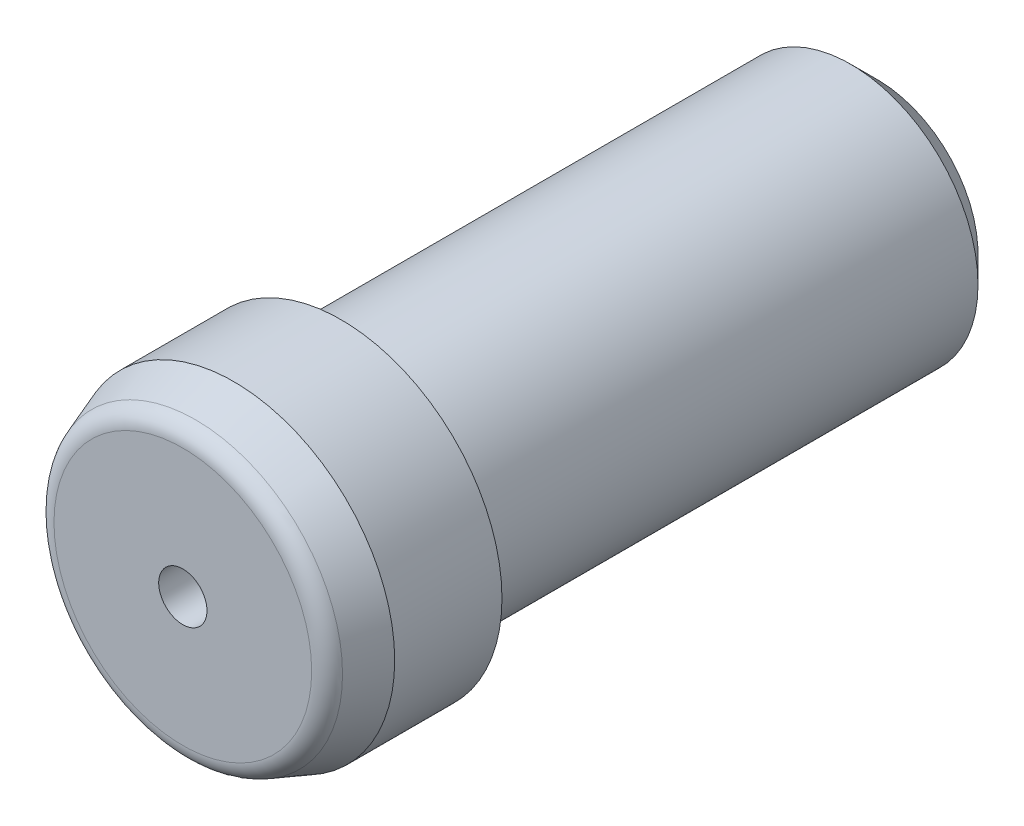
ISO-10303-21;
HEADER;
FILE_DESCRIPTION(('STEP AP214'),'2;1');
FILE_NAME('part.step','',(''),(''),'','','');
FILE_SCHEMA(('AUTOMOTIVE_DESIGN { 1 0 10303 214 1 1 1 1 }'));
ENDSEC;
DATA;
#1=APPLICATION_CONTEXT('core data for automotive mechanical design processes');
#2=APPLICATION_PROTOCOL_DEFINITION('international standard','automotive_design',2000,#1);
#3=PRODUCT_CONTEXT('',#1,'mechanical');
#4=PRODUCT('Part','Part','',(#3));
#5=PRODUCT_RELATED_PRODUCT_CATEGORY('part','',(#4));
#6=PRODUCT_DEFINITION_FORMATION('','',#4);
#7=PRODUCT_DEFINITION_CONTEXT('part definition',#1,'design');
#8=PRODUCT_DEFINITION('design','',#6,#7);
#9=PRODUCT_DEFINITION_SHAPE('','',#8);
#10=(LENGTH_UNIT() NAMED_UNIT(*) SI_UNIT(.MILLI.,.METRE.));
#11=(NAMED_UNIT(*) PLANE_ANGLE_UNIT() SI_UNIT($,.RADIAN.));
#12=(NAMED_UNIT(*) SI_UNIT($,.STERADIAN.) SOLID_ANGLE_UNIT());
#13=UNCERTAINTY_MEASURE_WITH_UNIT(LENGTH_MEASURE(1.E-05),#10,'distance_accuracy_value','');
#14=(GEOMETRIC_REPRESENTATION_CONTEXT(3) GLOBAL_UNCERTAINTY_ASSIGNED_CONTEXT((#13)) GLOBAL_UNIT_ASSIGNED_CONTEXT((#10,
#11,#12)) REPRESENTATION_CONTEXT('',''));
#15=CARTESIAN_POINT('',(0.,0.,0.));
#16=DIRECTION('',(0.,0.,1.));
#17=DIRECTION('',(1.,0.,0.));
#18=AXIS2_PLACEMENT_3D('',#15,#16,#17);
#19=CARTESIAN_POINT('',(0.,0.,0.));
#20=DIRECTION('',(0.,0.,1.));
#21=DIRECTION('',(1.,0.,0.));
#22=AXIS2_PLACEMENT_3D('',#19,#20,#21);
#23=PLANE('',#22);
#24=CARTESIAN_POINT('',(0.,0.,0.));
#25=DIRECTION('',(0.,0.,1.));
#26=DIRECTION('',(1.,0.,0.));
#27=AXIS2_PLACEMENT_3D('',#24,#25,#26);
#28=CIRCLE('',#27,1.143);
#29=CARTESIAN_POINT('',(1.143,0.,0.));
#30=VERTEX_POINT('',#29);
#31=EDGE_CURVE('E81',#30,#30,#28,.T.);
#32=ORIENTED_EDGE('',*,*,#31,.F.);
#33=EDGE_LOOP('',(#32));
#34=FACE_BOUND('',#33,.T.);
#35=CARTESIAN_POINT('',(0.,0.,0.));
#36=DIRECTION('',(0.,0.,1.));
#37=DIRECTION('',(1.,0.,0.));
#38=AXIS2_PLACEMENT_3D('',#35,#36,#37);
#39=CIRCLE('',#38,6.10147005177671);
#40=CARTESIAN_POINT('',(6.10147005177671,0.,0.));
#41=VERTEX_POINT('',#40);
#42=EDGE_CURVE('E10',#41,#41,#39,.T.);
#43=ORIENTED_EDGE('',*,*,#42,.T.);
#44=EDGE_LOOP('',(#43));
#45=FACE_BOUND('',#44,.T.);
#46=ADVANCED_FACE('F30',(#34,#45),#23,.T.);
#47=CARTESIAN_POINT('',(0.,0.,-2.413));
#48=DIRECTION('',(0.,0.,-1.));
#49=DIRECTION('',(-1.,0.,0.));
#50=AXIS2_PLACEMENT_3D('',#47,#48,#49);
#51=CONICAL_SURFACE('',#50,7.62,0.34906585039886);
#52=CARTESIAN_POINT('',(0.,0.,-0.601656780943014));
#53=DIRECTION('',(0.,0.,1.));
#54=DIRECTION('',(1.,0.,0.));
#55=AXIS2_PLACEMENT_3D('',#52,#53,#54);
#56=CIRCLE('',#55,6.96072498422334);
#57=CARTESIAN_POINT('',(6.96072498422334,0.,-0.601656780943014));
#58=VERTEX_POINT('',#57);
#59=EDGE_CURVE('E37',#58,#58,#56,.F.);
#60=ORIENTED_EDGE('',*,*,#59,.T.);
#61=EDGE_LOOP('',(#60));
#62=FACE_BOUND('',#61,.T.);
#63=CARTESIAN_POINT('',(0.,0.,-2.413));
#64=DIRECTION('',(0.,0.,-1.));
#65=DIRECTION('',(-1.,0.,0.));
#66=AXIS2_PLACEMENT_3D('',#63,#64,#65);
#67=CIRCLE('',#66,7.62);
#68=CARTESIAN_POINT('',(-7.62,0.,-2.413));
#69=VERTEX_POINT('',#68);
#70=EDGE_CURVE('E50',#69,#69,#67,.T.);
#71=ORIENTED_EDGE('',*,*,#70,.F.);
#72=EDGE_LOOP('',(#71));
#73=FACE_BOUND('',#72,.T.);
#74=ADVANCED_FACE('F124',(#62,#73),#51,.T.);
#75=CARTESIAN_POINT('',(0.,0.,-133.35));
#76=DIRECTION('',(0.,0.,-1.));
#77=DIRECTION('',(-1.,0.,0.));
#78=AXIS2_PLACEMENT_3D('',#75,#76,#77);
#79=CYLINDRICAL_SURFACE('',#78,7.62);
#80=ORIENTED_EDGE('',*,*,#70,.T.);
#81=EDGE_LOOP('',(#80));
#82=FACE_BOUND('',#81,.T.);
#83=CARTESIAN_POINT('',(0.,0.,-7.493));
#84=DIRECTION('',(0.,0.,-1.));
#85=DIRECTION('',(-1.,0.,0.));
#86=AXIS2_PLACEMENT_3D('',#83,#84,#85);
#87=CIRCLE('',#86,7.62);
#88=CARTESIAN_POINT('',(-7.62,0.,-7.493));
#89=VERTEX_POINT('',#88);
#90=EDGE_CURVE('E54',#89,#89,#87,.T.);
#91=ORIENTED_EDGE('',*,*,#90,.F.);
#92=EDGE_LOOP('',(#91));
#93=FACE_BOUND('',#92,.T.);
#94=ADVANCED_FACE('F129',(#82,#93),#79,.T.);
#95=CARTESIAN_POINT('',(0.,7.62,-7.493));
#96=DIRECTION('',(0.,0.,-1.));
#97=DIRECTION('',(-1.,0.,0.));
#98=AXIS2_PLACEMENT_3D('',#95,#96,#97);
#99=PLANE('',#98);
#100=CARTESIAN_POINT('',(0.,0.,-7.493));
#101=DIRECTION('',(0.,0.,-1.));
#102=DIRECTION('',(-1.,0.,0.));
#103=AXIS2_PLACEMENT_3D('',#100,#101,#102);
#104=CIRCLE('',#103,6.54049999999999);
#105=CARTESIAN_POINT('',(-6.54049999999999,0.,-7.493));
#106=VERTEX_POINT('',#105);
#107=EDGE_CURVE('E51',#106,#106,#104,.T.);
#108=ORIENTED_EDGE('',*,*,#107,.F.);
#109=EDGE_LOOP('',(#108));
#110=FACE_BOUND('',#109,.T.);
#111=ORIENTED_EDGE('',*,*,#90,.T.);
#112=EDGE_LOOP('',(#111));
#113=FACE_BOUND('',#112,.T.);
#114=ADVANCED_FACE('F135',(#110,#113),#99,.T.);
#115=CARTESIAN_POINT('',(0.,0.,-7.747));
#116=DIRECTION('',(0.,0.,-1.));
#117=DIRECTION('',(-1.,0.,0.));
#118=AXIS2_PLACEMENT_3D('',#115,#116,#117);
#119=CONICAL_SURFACE('',#118,6.79449999999999,0.785398163397437);
#120=ORIENTED_EDGE('',*,*,#107,.T.);
#121=EDGE_LOOP('',(#120));
#122=FACE_BOUND('',#121,.T.);
#123=CARTESIAN_POINT('',(0.,0.,-7.29479615818396));
#124=DIRECTION('',(0.,0.,-1.));
#125=DIRECTION('',(-1.,0.,0.));
#126=AXIS2_PLACEMENT_3D('',#123,#124,#125);
#127=CIRCLE('',#126,6.34229615818395);
#128=CARTESIAN_POINT('',(-6.34229615818395,0.,-7.29479615818396));
#129=VERTEX_POINT('',#128);
#130=EDGE_CURVE('E58',#129,#129,#127,.T.);
#131=ORIENTED_EDGE('',*,*,#130,.F.);
#132=EDGE_LOOP('',(#131));
#133=FACE_BOUND('',#132,.T.);
#134=ADVANCED_FACE('F138',(#122,#133),#119,.F.);
#135=CARTESIAN_POINT('',(0.,0.,-7.4295));
#136=DIRECTION('',(0.,0.,-1.));
#137=DIRECTION('',(-1.,0.,0.));
#138=AXIS2_PLACEMENT_3D('',#135,#136,#137);
#139=TOROIDAL_SURFACE('',#138,6.20759231636792,0.1905);
#140=CARTESIAN_POINT('',(0.,0.,-7.239));
#141=DIRECTION('',(0.,0.,-1.));
#142=DIRECTION('',(-1.,0.,0.));
#143=AXIS2_PLACEMENT_3D('',#140,#141,#142);
#144=CIRCLE('',#143,6.20759231636792);
#145=CARTESIAN_POINT('',(-6.20759231636792,0.,-7.239));
#146=VERTEX_POINT('',#145);
#147=EDGE_CURVE('E65',#146,#146,#144,.T.);
#148=ORIENTED_EDGE('',*,*,#147,.F.);
#149=EDGE_LOOP('',(#148));
#150=FACE_BOUND('',#149,.T.);
#151=ORIENTED_EDGE('',*,*,#130,.T.);
#152=EDGE_LOOP('',(#151));
#153=FACE_BOUND('',#152,.T.);
#154=ADVANCED_FACE('F143',(#150,#153),#139,.F.);
#155=CARTESIAN_POINT('',(0.,6.20759231636792,-7.239));
#156=DIRECTION('',(0.,0.,1.));
#157=DIRECTION('',(1.,0.,0.));
#158=AXIS2_PLACEMENT_3D('',#155,#156,#157);
#159=PLANE('',#158);
#160=CARTESIAN_POINT('',(0.,0.,-7.239));
#161=DIRECTION('',(0.,0.,-1.));
#162=DIRECTION('',(-1.,0.,0.));
#163=AXIS2_PLACEMENT_3D('',#160,#161,#162);
#164=CIRCLE('',#163,5.96899999999999);
#165=CARTESIAN_POINT('',(-5.96899999999999,0.,-7.239));
#166=VERTEX_POINT('',#165);
#167=EDGE_CURVE('E68',#166,#166,#164,.T.);
#168=ORIENTED_EDGE('',*,*,#167,.F.);
#169=EDGE_LOOP('',(#168));
#170=FACE_BOUND('',#169,.T.);
#171=ORIENTED_EDGE('',*,*,#147,.T.);
#172=EDGE_LOOP('',(#171));
#173=FACE_BOUND('',#172,.T.);
#174=ADVANCED_FACE('F147',(#170,#173),#159,.F.);
#175=CARTESIAN_POINT('',(0.,0.,-7.4295));
#176=DIRECTION('',(0.,0.,-1.));
#177=DIRECTION('',(-1.,0.,0.));
#178=AXIS2_PLACEMENT_3D('',#175,#176,#177);
#179=TOROIDAL_SURFACE('',#178,5.96899999999999,0.1905);
#180=CARTESIAN_POINT('',(0.,0.,-7.42950000000001));
#181=DIRECTION('',(0.,0.,-1.));
#182=DIRECTION('',(-1.,0.,0.));
#183=AXIS2_PLACEMENT_3D('',#180,#181,#182);
#184=CIRCLE('',#183,5.77849999999999);
#185=CARTESIAN_POINT('',(-5.77849999999999,0.,-7.42950000000001));
#186=VERTEX_POINT('',#185);
#187=EDGE_CURVE('E71',#186,#186,#184,.T.);
#188=ORIENTED_EDGE('',*,*,#187,.F.);
#189=EDGE_LOOP('',(#188));
#190=FACE_BOUND('',#189,.T.);
#191=ORIENTED_EDGE('',*,*,#167,.T.);
#192=EDGE_LOOP('',(#191));
#193=FACE_BOUND('',#192,.T.);
#194=ADVANCED_FACE('F151',(#190,#193),#179,.F.);
#195=CARTESIAN_POINT('',(0.,0.,-133.35));
#196=DIRECTION('',(0.,0.,-1.));
#197=DIRECTION('',(-1.,0.,0.));
#198=AXIS2_PLACEMENT_3D('',#195,#196,#197);
#199=CYLINDRICAL_SURFACE('',#198,5.77849999999999);
#200=CARTESIAN_POINT('',(0.,0.,-7.66809231636792));
#201=DIRECTION('',(0.,0.,-1.));
#202=DIRECTION('',(-1.,0.,0.));
#203=AXIS2_PLACEMENT_3D('',#200,#201,#202);
#204=CIRCLE('',#203,5.77849999999999);
#205=CARTESIAN_POINT('',(-5.77849999999999,0.,-7.66809231636792));
#206=VERTEX_POINT('',#205);
#207=EDGE_CURVE('E74',#206,#206,#204,.T.);
#208=ORIENTED_EDGE('',*,*,#207,.F.);
#209=EDGE_LOOP('',(#208));
#210=FACE_BOUND('',#209,.T.);
#211=ORIENTED_EDGE('',*,*,#187,.T.);
#212=EDGE_LOOP('',(#211));
#213=FACE_BOUND('',#212,.T.);
#214=ADVANCED_FACE('F155',(#210,#213),#199,.T.);
#215=CARTESIAN_POINT('',(0.,0.,-7.66809231636793));
#216=DIRECTION('',(0.,0.,-1.));
#217=DIRECTION('',(-1.,0.,0.));
#218=AXIS2_PLACEMENT_3D('',#215,#216,#217);
#219=TOROIDAL_SURFACE('',#218,5.96899999999999,0.1905);
#220=CARTESIAN_POINT('',(0.,0.,-7.80279615818397));
#221=DIRECTION('',(0.,0.,-1.));
#222=DIRECTION('',(-1.,0.,0.));
#223=AXIS2_PLACEMENT_3D('',#220,#221,#222);
#224=CIRCLE('',#223,5.83429615818395);
#225=CARTESIAN_POINT('',(-5.83429615818395,0.,-7.80279615818397));
#226=VERTEX_POINT('',#225);
#227=EDGE_CURVE('E77',#226,#226,#224,.T.);
#228=ORIENTED_EDGE('',*,*,#227,.F.);
#229=EDGE_LOOP('',(#228));
#230=FACE_BOUND('',#229,.T.);
#231=ORIENTED_EDGE('',*,*,#207,.T.);
#232=EDGE_LOOP('',(#231));
#233=FACE_BOUND('',#232,.T.);
#234=ADVANCED_FACE('F159',(#230,#233),#219,.F.);
#235=CARTESIAN_POINT('',(0.,0.,-7.80279615818397));
#236=DIRECTION('',(0.,0.,-1.));
#237=DIRECTION('',(-1.,0.,0.));
#238=AXIS2_PLACEMENT_3D('',#235,#236,#237);
#239=CONICAL_SURFACE('',#238,5.83429615818395,0.78539816339744);
#240=CARTESIAN_POINT('',(0.,0.,-8.00100000000001));
#241=DIRECTION('',(0.,0.,-1.));
#242=DIRECTION('',(-1.,0.,0.));
#243=AXIS2_PLACEMENT_3D('',#240,#241,#242);
#244=CIRCLE('',#243,6.03249999999999);
#245=CARTESIAN_POINT('',(-6.03249999999999,0.,-8.00100000000001));
#246=VERTEX_POINT('',#245);
#247=EDGE_CURVE('E55',#246,#246,#244,.F.);
#248=ORIENTED_EDGE('',*,*,#247,.T.);
#249=EDGE_LOOP('',(#248));
#250=FACE_BOUND('',#249,.T.);
#251=ORIENTED_EDGE('',*,*,#227,.T.);
#252=EDGE_LOOP('',(#251));
#253=FACE_BOUND('',#252,.T.);
#254=ADVANCED_FACE('F106',(#250,#253),#239,.T.);
#255=CARTESIAN_POINT('',(0.,6.03249999999999,-32.893));
#256=DIRECTION('',(0.,0.,-1.));
#257=DIRECTION('',(-1.,0.,0.));
#258=AXIS2_PLACEMENT_3D('',#255,#256,#257);
#259=PLANE('',#258);
#260=CARTESIAN_POINT('',(0.,0.,-32.893));
#261=DIRECTION('',(0.,0.,-1.));
#262=DIRECTION('',(-1.,0.,0.));
#263=AXIS2_PLACEMENT_3D('',#260,#261,#262);
#264=CIRCLE('',#263,1.143);
#265=CARTESIAN_POINT('',(-1.143,0.,-32.893));
#266=VERTEX_POINT('',#265);
#267=EDGE_CURVE('E87',#266,#266,#264,.T.);
#268=ORIENTED_EDGE('',*,*,#267,.F.);
#269=EDGE_LOOP('',(#268));
#270=FACE_BOUND('',#269,.T.);
#271=CARTESIAN_POINT('',(0.,0.,-32.893));
#272=DIRECTION('',(0.,0.,-1.));
#273=DIRECTION('',(-1.,0.,0.));
#274=AXIS2_PLACEMENT_3D('',#271,#272,#273);
#275=CIRCLE('',#274,4.76250000000001);
#276=CARTESIAN_POINT('',(-4.76250000000001,0.,-32.893));
#277=VERTEX_POINT('',#276);
#278=EDGE_CURVE('E45',#277,#277,#275,.T.);
#279=ORIENTED_EDGE('',*,*,#278,.T.);
#280=EDGE_LOOP('',(#279));
#281=FACE_BOUND('',#280,.T.);
#282=ADVANCED_FACE('F102',(#270,#281),#259,.T.);
#283=CARTESIAN_POINT('',(0.,0.,-133.35));
#284=DIRECTION('',(0.,0.,-1.));
#285=DIRECTION('',(-1.,0.,0.));
#286=AXIS2_PLACEMENT_3D('',#283,#284,#285);
#287=CYLINDRICAL_SURFACE('',#286,6.03249999999999);
#288=CARTESIAN_POINT('',(0.,0.,-31.623));
#289=DIRECTION('',(0.,0.,-1.));
#290=DIRECTION('',(-1.,0.,0.));
#291=AXIS2_PLACEMENT_3D('',#288,#289,#290);
#292=CIRCLE('',#291,6.03249999999999);
#293=CARTESIAN_POINT('',(-6.03249999999999,0.,-31.623));
#294=VERTEX_POINT('',#293);
#295=EDGE_CURVE('E41',#294,#294,#292,.F.);
#296=ORIENTED_EDGE('',*,*,#295,.T.);
#297=EDGE_LOOP('',(#296));
#298=FACE_BOUND('',#297,.T.);
#299=ORIENTED_EDGE('',*,*,#247,.F.);
#300=EDGE_LOOP('',(#299));
#301=FACE_BOUND('',#300,.T.);
#302=ADVANCED_FACE('F105',(#298,#301),#287,.T.);
#303=CARTESIAN_POINT('',(0.,0.,-32.893));
#304=DIRECTION('',(0.,0.,1.));
#305=DIRECTION('',(1.,0.,0.));
#306=AXIS2_PLACEMENT_3D('',#303,#304,#305);
#307=CONICAL_SURFACE('',#306,4.7625,0.785398163397442);
#308=ORIENTED_EDGE('',*,*,#295,.F.);
#309=EDGE_LOOP('',(#308));
#310=FACE_BOUND('',#309,.T.);
#311=ORIENTED_EDGE('',*,*,#278,.F.);
#312=EDGE_LOOP('',(#311));
#313=FACE_BOUND('',#312,.T.);
#314=ADVANCED_FACE('F110',(#310,#313),#307,.T.);
#315=CARTESIAN_POINT('',(0.,0.,-0.9144));
#316=DIRECTION('',(0.,0.,1.));
#317=DIRECTION('',(1.,0.,0.));
#318=AXIS2_PLACEMENT_3D('',#315,#316,#317);
#319=TOROIDAL_SURFACE('',#318,6.10147005177671,0.9144);
#320=ORIENTED_EDGE('',*,*,#42,.F.);
#321=EDGE_LOOP('',(#320));
#322=FACE_BOUND('',#321,.T.);
#323=ORIENTED_EDGE('',*,*,#59,.F.);
#324=EDGE_LOOP('',(#323));
#325=FACE_BOUND('',#324,.T.);
#326=ADVANCED_FACE('F32',(#322,#325),#319,.T.);
#327=CARTESIAN_POINT('',(0.,0.,-2.54));
#328=DIRECTION('',(0.,0.,1.));
#329=DIRECTION('',(1.,0.,0.));
#330=AXIS2_PLACEMENT_3D('',#327,#328,#329);
#331=CYLINDRICAL_SURFACE('',#330,1.143);
#332=CARTESIAN_POINT('',(0.,0.,-2.54));
#333=DIRECTION('',(0.,0.,1.));
#334=DIRECTION('',(1.,0.,0.));
#335=AXIS2_PLACEMENT_3D('',#332,#333,#334);
#336=CIRCLE('',#335,1.143);
#337=CARTESIAN_POINT('',(1.143,0.,-2.54));
#338=VERTEX_POINT('',#337);
#339=EDGE_CURVE('E80',#338,#338,#336,.T.);
#340=ORIENTED_EDGE('',*,*,#339,.F.);
#341=EDGE_LOOP('',(#340));
#342=FACE_BOUND('',#341,.T.);
#343=ORIENTED_EDGE('',*,*,#31,.T.);
#344=EDGE_LOOP('',(#343));
#345=FACE_BOUND('',#344,.T.);
#346=ADVANCED_FACE('F117',(#342,#345),#331,.F.);
#347=CARTESIAN_POINT('',(0.,0.,-2.54));
#348=DIRECTION('',(0.,0.,1.));
#349=DIRECTION('',(1.,0.,0.));
#350=AXIS2_PLACEMENT_3D('',#347,#348,#349);
#351=PLANE('',#350);
#352=ORIENTED_EDGE('',*,*,#339,.T.);
#353=EDGE_LOOP('',(#352));
#354=FACE_BOUND('',#353,.T.);
#355=ADVANCED_FACE('F98',(#354),#351,.T.);
#356=CARTESIAN_POINT('',(0.,0.,-30.353));
#357=DIRECTION('',(0.,0.,-1.));
#358=DIRECTION('',(-1.,0.,0.));
#359=AXIS2_PLACEMENT_3D('',#356,#357,#358);
#360=CYLINDRICAL_SURFACE('',#359,1.143);
#361=CARTESIAN_POINT('',(0.,0.,-30.353));
#362=DIRECTION('',(0.,0.,-1.));
#363=DIRECTION('',(-1.,0.,0.));
#364=AXIS2_PLACEMENT_3D('',#361,#362,#363);
#365=CIRCLE('',#364,1.143);
#366=CARTESIAN_POINT('',(-1.143,0.,-30.353));
#367=VERTEX_POINT('',#366);
#368=EDGE_CURVE('E84',#367,#367,#365,.T.);
#369=ORIENTED_EDGE('',*,*,#368,.F.);
#370=EDGE_LOOP('',(#369));
#371=FACE_BOUND('',#370,.T.);
#372=ORIENTED_EDGE('',*,*,#267,.T.);
#373=EDGE_LOOP('',(#372));
#374=FACE_BOUND('',#373,.T.);
#375=ADVANCED_FACE('F95',(#371,#374),#360,.F.);
#376=CARTESIAN_POINT('',(0.,0.,-30.353));
#377=DIRECTION('',(0.,0.,-1.));
#378=DIRECTION('',(-1.,0.,0.));
#379=AXIS2_PLACEMENT_3D('',#376,#377,#378);
#380=PLANE('',#379);
#381=ORIENTED_EDGE('',*,*,#368,.T.);
#382=EDGE_LOOP('',(#381));
#383=FACE_BOUND('',#382,.T.);
#384=ADVANCED_FACE('F93',(#383),#380,.T.);
#385=CLOSED_SHELL('',(#46,#74,#94,#114,#134,#154,#174,#194,#214,#234,#254,#282,#302,#314,#326,
#346,#355,#375,#384));
#386=MANIFOLD_SOLID_BREP('B2',#385);
#387=ADVANCED_BREP_SHAPE_REPRESENTATION('',(#18,#386),#14);
#388=SHAPE_DEFINITION_REPRESENTATION(#9,#387);
ENDSEC;
END-ISO-10303-21;
